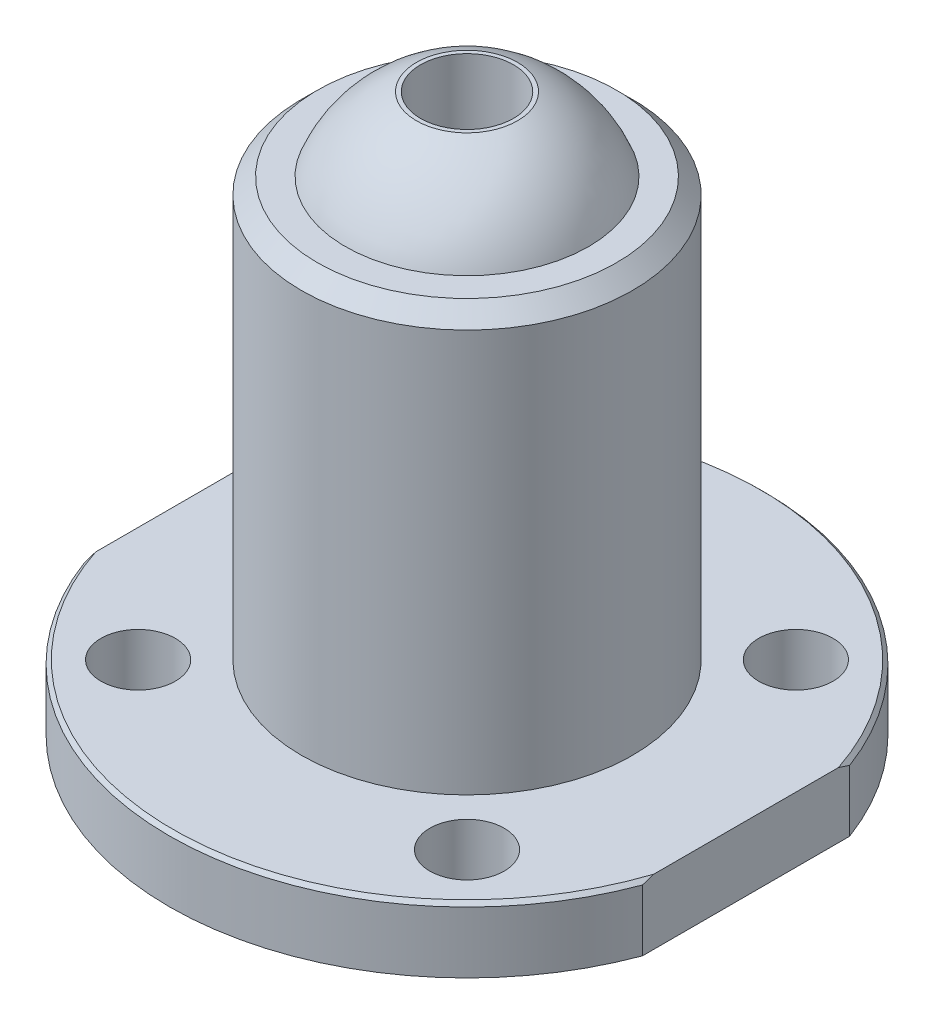
ISO-10303-21;
HEADER;
FILE_DESCRIPTION(('STEP AP214'),'2;1');
FILE_NAME('part.step','',(''),(''),'','','');
FILE_SCHEMA(('AUTOMOTIVE_DESIGN { 1 0 10303 214 1 1 1 1 }'));
ENDSEC;
DATA;
#1=APPLICATION_CONTEXT('core data for automotive mechanical design processes');
#2=APPLICATION_PROTOCOL_DEFINITION('international standard','automotive_design',2000,#1);
#3=PRODUCT_CONTEXT('',#1,'mechanical');
#4=PRODUCT('Part','Part','',(#3));
#5=PRODUCT_RELATED_PRODUCT_CATEGORY('part','',(#4));
#6=PRODUCT_DEFINITION_FORMATION('','',#4);
#7=PRODUCT_DEFINITION_CONTEXT('part definition',#1,'design');
#8=PRODUCT_DEFINITION('design','',#6,#7);
#9=PRODUCT_DEFINITION_SHAPE('','',#8);
#10=(LENGTH_UNIT() NAMED_UNIT(*) SI_UNIT(.MILLI.,.METRE.));
#11=(NAMED_UNIT(*) PLANE_ANGLE_UNIT() SI_UNIT($,.RADIAN.));
#12=(NAMED_UNIT(*) SI_UNIT($,.STERADIAN.) SOLID_ANGLE_UNIT());
#13=UNCERTAINTY_MEASURE_WITH_UNIT(LENGTH_MEASURE(1.E-05),#10,'distance_accuracy_value','');
#14=(GEOMETRIC_REPRESENTATION_CONTEXT(3) GLOBAL_UNCERTAINTY_ASSIGNED_CONTEXT((#13)) GLOBAL_UNIT_ASSIGNED_CONTEXT((#10,
#11,#12)) REPRESENTATION_CONTEXT('',''));
#15=CARTESIAN_POINT('',(0.,0.,0.));
#16=DIRECTION('',(0.,0.,1.));
#17=DIRECTION('',(1.,0.,0.));
#18=AXIS2_PLACEMENT_3D('',#15,#16,#17);
#19=CARTESIAN_POINT('',(0.,33.5828427942722,0.));
#20=DIRECTION('',(0.,1.,0.));
#21=DIRECTION('',(0.,0.,1.));
#22=AXIS2_PLACEMENT_3D('',#19,#20,#21);
#23=CYLINDRICAL_SURFACE('',#22,16.);
#24=DIRECTION('',(0.,1.,0.));
#25=VECTOR('',#24,1.);
#26=CARTESIAN_POINT('',(15.,-1.5,5.56776436283002));
#27=LINE('',#26,#25);
#28=CARTESIAN_POINT('',(15.,0.,5.56776436283002));
#29=VERTEX_POINT('',#28);
#30=CARTESIAN_POINT('',(15.,3.30000000000001,5.56776436283002));
#31=VERTEX_POINT('',#30);
#32=EDGE_CURVE('E297',#29,#31,#27,.T.);
#33=ORIENTED_EDGE('',*,*,#32,.T.);
#34=CARTESIAN_POINT('',(0.,3.30000000000001,0.));
#35=DIRECTION('',(0.,-1.,0.));
#36=DIRECTION('',(0.,0.,-1.));
#37=AXIS2_PLACEMENT_3D('',#34,#35,#36);
#38=CIRCLE('',#37,16.);
#39=CARTESIAN_POINT('',(-15.,3.30000000000001,5.56776436283002));
#40=VERTEX_POINT('',#39);
#41=EDGE_CURVE('E70',#31,#40,#38,.T.);
#42=ORIENTED_EDGE('',*,*,#41,.T.);
#43=DIRECTION('',(0.,1.,0.));
#44=VECTOR('',#43,1.);
#45=CARTESIAN_POINT('',(-15.,-1.5,5.56776436283002));
#46=LINE('',#45,#44);
#47=CARTESIAN_POINT('',(-15.,0.,5.56776436283002));
#48=VERTEX_POINT('',#47);
#49=EDGE_CURVE('E101',#48,#40,#46,.T.);
#50=ORIENTED_EDGE('',*,*,#49,.F.);
#51=CARTESIAN_POINT('',(0.,0.,0.));
#52=DIRECTION('',(0.,1.,0.));
#53=DIRECTION('',(0.,0.,1.));
#54=AXIS2_PLACEMENT_3D('',#51,#52,#53);
#55=CIRCLE('',#54,16.);
#56=EDGE_CURVE('E113',#48,#29,#55,.T.);
#57=ORIENTED_EDGE('',*,*,#56,.T.);
#58=EDGE_LOOP('',(#33,#42,#50,#57));
#59=FACE_BOUND('',#58,.T.);
#60=ADVANCED_FACE('F44',(#59),#23,.T.);
#61=CARTESIAN_POINT('',(0.,0.,0.));
#62=DIRECTION('',(0.,1.,0.));
#63=DIRECTION('',(0.,0.,1.));
#64=AXIS2_PLACEMENT_3D('',#61,#62,#63);
#65=PLANE('',#64);
#66=CARTESIAN_POINT('',(8.83883476483228,0.,8.83883476483189));
#67=DIRECTION('',(0.,1.,0.));
#68=DIRECTION('',(0.,0.,1.));
#69=AXIS2_PLACEMENT_3D('',#66,#67,#68);
#70=CIRCLE('',#69,1.99999999999987);
#71=CARTESIAN_POINT('',(8.83883476483228,0.,10.8388347648318));
#72=VERTEX_POINT('',#71);
#73=EDGE_CURVE('E110',#72,#72,#70,.T.);
#74=ORIENTED_EDGE('',*,*,#73,.T.);
#75=EDGE_LOOP('',(#74));
#76=FACE_BOUND('',#75,.T.);
#77=CARTESIAN_POINT('',(-8.83883476483141,0.,8.83883476483228));
#78=DIRECTION('',(0.,1.,0.));
#79=DIRECTION('',(0.,0.,1.));
#80=AXIS2_PLACEMENT_3D('',#77,#78,#79);
#81=CIRCLE('',#80,2.00000000000036);
#82=CARTESIAN_POINT('',(-8.83883476483141,0.,10.8388347648326));
#83=VERTEX_POINT('',#82);
#84=EDGE_CURVE('E317',#83,#83,#81,.T.);
#85=ORIENTED_EDGE('',*,*,#84,.T.);
#86=EDGE_LOOP('',(#85));
#87=FACE_BOUND('',#86,.T.);
#88=CARTESIAN_POINT('',(-8.8388347648318,0.,-8.83883476483141));
#89=DIRECTION('',(0.,1.,0.));
#90=DIRECTION('',(0.,0.,1.));
#91=AXIS2_PLACEMENT_3D('',#88,#89,#90);
#92=CIRCLE('',#91,2.00000000000052);
#93=CARTESIAN_POINT('',(-8.8388347648318,0.,-6.83883476483088));
#94=VERTEX_POINT('',#93);
#95=EDGE_CURVE('E313',#94,#94,#92,.T.);
#96=ORIENTED_EDGE('',*,*,#95,.T.);
#97=EDGE_LOOP('',(#96));
#98=FACE_BOUND('',#97,.T.);
#99=CARTESIAN_POINT('',(8.83883476483189,0.,-8.8388347648318));
#100=DIRECTION('',(0.,1.,0.));
#101=DIRECTION('',(0.,0.,1.));
#102=AXIS2_PLACEMENT_3D('',#99,#100,#101);
#103=CIRCLE('',#102,2.);
#104=CARTESIAN_POINT('',(8.83883476483189,0.,-6.8388347648318));
#105=VERTEX_POINT('',#104);
#106=EDGE_CURVE('E309',#105,#105,#103,.T.);
#107=ORIENTED_EDGE('',*,*,#106,.T.);
#108=EDGE_LOOP('',(#107));
#109=FACE_BOUND('',#108,.T.);
#110=CARTESIAN_POINT('',(15.,0.,-5.56776436283002));
#111=VERTEX_POINT('',#110);
#112=CARTESIAN_POINT('',(-15.,0.,-5.56776436283002));
#113=VERTEX_POINT('',#112);
#114=EDGE_CURVE('E120',#111,#113,#55,.T.);
#115=ORIENTED_EDGE('',*,*,#114,.F.);
#116=DIRECTION('',(0.,0.,1.));
#117=VECTOR('',#116,1.);
#118=CARTESIAN_POINT('',(15.,0.,0.));
#119=LINE('',#118,#117);
#120=EDGE_CURVE('E109',#111,#29,#119,.T.);
#121=ORIENTED_EDGE('',*,*,#120,.T.);
#122=ORIENTED_EDGE('',*,*,#56,.F.);
#123=DIRECTION('',(0.,0.,-1.));
#124=VECTOR('',#123,1.);
#125=CARTESIAN_POINT('',(-15.,0.,0.));
#126=LINE('',#125,#124);
#127=EDGE_CURVE('E99',#48,#113,#126,.T.);
#128=ORIENTED_EDGE('',*,*,#127,.T.);
#129=EDGE_LOOP('',(#115,#121,#122,#128));
#130=FACE_BOUND('',#129,.T.);
#131=ADVANCED_FACE('F118',(#76,#87,#98,#109,#130),#65,.F.);
#132=DIRECTION('',(0.,1.,0.));
#133=VECTOR('',#132,1.);
#134=CARTESIAN_POINT('',(-15.,-1.5,-5.56776436283002));
#135=LINE('',#134,#133);
#136=CARTESIAN_POINT('',(-15.,3.30000000000001,-5.56776436283002));
#137=VERTEX_POINT('',#136);
#138=EDGE_CURVE('E103',#113,#137,#135,.T.);
#139=ORIENTED_EDGE('',*,*,#138,.T.);
#140=CARTESIAN_POINT('',(0.,3.30000000000001,0.));
#141=DIRECTION('',(0.,-1.,0.));
#142=DIRECTION('',(0.,0.,-1.));
#143=AXIS2_PLACEMENT_3D('',#140,#141,#142);
#144=CIRCLE('',#143,16.);
#145=CARTESIAN_POINT('',(15.,3.30000000000001,-5.56776436283002));
#146=VERTEX_POINT('',#145);
#147=EDGE_CURVE('E11',#137,#146,#144,.T.);
#148=ORIENTED_EDGE('',*,*,#147,.T.);
#149=DIRECTION('',(0.,1.,0.));
#150=VECTOR('',#149,1.);
#151=CARTESIAN_POINT('',(15.,-1.5,-5.56776436283002));
#152=LINE('',#151,#150);
#153=EDGE_CURVE('E290',#111,#146,#152,.T.);
#154=ORIENTED_EDGE('',*,*,#153,.F.);
#155=ORIENTED_EDGE('',*,*,#114,.T.);
#156=EDGE_LOOP('',(#139,#148,#154,#155));
#157=FACE_BOUND('',#156,.T.);
#158=ADVANCED_FACE('F198',(#157),#23,.T.);
#159=CARTESIAN_POINT('',(16.,3.5,0.));
#160=DIRECTION('',(0.,-1.,0.));
#161=DIRECTION('',(0.,0.,-1.));
#162=AXIS2_PLACEMENT_3D('',#159,#160,#161);
#163=PLANE('',#162);
#164=CARTESIAN_POINT('',(8.83883476483228,3.5,8.83883476483189));
#165=DIRECTION('',(0.,1.,0.));
#166=DIRECTION('',(0.,0.,1.));
#167=AXIS2_PLACEMENT_3D('',#164,#165,#166);
#168=CIRCLE('',#167,1.99999999999987);
#169=CARTESIAN_POINT('',(8.83883476483228,3.5,10.8388347648318));
#170=VERTEX_POINT('',#169);
#171=EDGE_CURVE('E301',#170,#170,#168,.T.);
#172=ORIENTED_EDGE('',*,*,#171,.F.);
#173=EDGE_LOOP('',(#172));
#174=FACE_BOUND('',#173,.T.);
#175=CARTESIAN_POINT('',(-8.83883476483141,3.5,8.83883476483228));
#176=DIRECTION('',(0.,1.,0.));
#177=DIRECTION('',(0.,0.,1.));
#178=AXIS2_PLACEMENT_3D('',#175,#176,#177);
#179=CIRCLE('',#178,2.00000000000036);
#180=CARTESIAN_POINT('',(-8.83883476483141,3.5,10.8388347648326));
#181=VERTEX_POINT('',#180);
#182=EDGE_CURVE('E359',#181,#181,#179,.T.);
#183=ORIENTED_EDGE('',*,*,#182,.F.);
#184=EDGE_LOOP('',(#183));
#185=FACE_BOUND('',#184,.T.);
#186=CARTESIAN_POINT('',(-8.8388347648318,3.5,-8.83883476483141));
#187=DIRECTION('',(0.,1.,0.));
#188=DIRECTION('',(0.,0.,1.));
#189=AXIS2_PLACEMENT_3D('',#186,#187,#188);
#190=CIRCLE('',#189,2.00000000000052);
#191=CARTESIAN_POINT('',(-8.8388347648318,3.5,-6.83883476483088));
#192=VERTEX_POINT('',#191);
#193=EDGE_CURVE('E303',#192,#192,#190,.T.);
#194=ORIENTED_EDGE('',*,*,#193,.F.);
#195=EDGE_LOOP('',(#194));
#196=FACE_BOUND('',#195,.T.);
#197=CARTESIAN_POINT('',(8.83883476483189,3.5,-8.8388347648318));
#198=DIRECTION('',(0.,1.,0.));
#199=DIRECTION('',(0.,0.,1.));
#200=AXIS2_PLACEMENT_3D('',#197,#198,#199);
#201=CIRCLE('',#200,2.);
#202=CARTESIAN_POINT('',(8.83883476483189,3.5,-6.8388347648318));
#203=VERTEX_POINT('',#202);
#204=EDGE_CURVE('E305',#203,#203,#201,.T.);
#205=ORIENTED_EDGE('',*,*,#204,.F.);
#206=EDGE_LOOP('',(#205));
#207=FACE_BOUND('',#206,.T.);
#208=CARTESIAN_POINT('',(0.,3.5,0.));
#209=DIRECTION('',(0.,1.,0.));
#210=DIRECTION('',(0.,0.,1.));
#211=AXIS2_PLACEMENT_3D('',#208,#209,#210);
#212=CIRCLE('',#211,8.9);
#213=CARTESIAN_POINT('',(0.,3.5,8.9));
#214=VERTEX_POINT('',#213);
#215=EDGE_CURVE('E121',#214,#214,#212,.T.);
#216=ORIENTED_EDGE('',*,*,#215,.F.);
#217=EDGE_LOOP('',(#216));
#218=FACE_BOUND('',#217,.T.);
#219=DIRECTION('',(0.,0.,-1.));
#220=VECTOR('',#219,1.);
#221=CARTESIAN_POINT('',(-15.,3.5,-5.56776436283002));
#222=LINE('',#221,#220);
#223=CARTESIAN_POINT('',(-15.,3.5,4.96386945839638));
#224=VERTEX_POINT('',#223);
#225=CARTESIAN_POINT('',(-15.,3.5,-4.96386945839638));
#226=VERTEX_POINT('',#225);
#227=EDGE_CURVE('E115',#224,#226,#222,.T.);
#228=ORIENTED_EDGE('',*,*,#227,.F.);
#229=CARTESIAN_POINT('',(0.,3.5,0.));
#230=DIRECTION('',(0.,-1.,0.));
#231=DIRECTION('',(0.,0.,-1.));
#232=AXIS2_PLACEMENT_3D('',#229,#230,#231);
#233=CIRCLE('',#232,15.8);
#234=CARTESIAN_POINT('',(15.,3.5,4.96386945839638));
#235=VERTEX_POINT('',#234);
#236=EDGE_CURVE('E134',#224,#235,#233,.F.);
#237=ORIENTED_EDGE('',*,*,#236,.T.);
#238=DIRECTION('',(0.,0.,1.));
#239=VECTOR('',#238,1.);
#240=CARTESIAN_POINT('',(15.,3.5,-5.56776436283002));
#241=LINE('',#240,#239);
#242=CARTESIAN_POINT('',(15.,3.5,-4.96386945839638));
#243=VERTEX_POINT('',#242);
#244=EDGE_CURVE('E288',#243,#235,#241,.T.);
#245=ORIENTED_EDGE('',*,*,#244,.F.);
#246=CARTESIAN_POINT('',(0.,3.5,0.));
#247=DIRECTION('',(0.,-1.,0.));
#248=DIRECTION('',(0.,0.,-1.));
#249=AXIS2_PLACEMENT_3D('',#246,#247,#248);
#250=CIRCLE('',#249,15.8);
#251=EDGE_CURVE('E125',#243,#226,#250,.F.);
#252=ORIENTED_EDGE('',*,*,#251,.T.);
#253=EDGE_LOOP('',(#228,#237,#245,#252));
#254=FACE_BOUND('',#253,.T.);
#255=ADVANCED_FACE('F194',(#174,#185,#196,#207,#218,#254),#163,.F.);
#256=CARTESIAN_POINT('',(0.,33.5828427942722,0.));
#257=DIRECTION('',(0.,1.,0.));
#258=DIRECTION('',(0.,0.,1.));
#259=AXIS2_PLACEMENT_3D('',#256,#257,#258);
#260=CYLINDRICAL_SURFACE('',#259,8.9);
#261=CARTESIAN_POINT('',(0.,25.138348415311,0.));
#262=DIRECTION('',(0.,1.,0.));
#263=DIRECTION('',(0.,0.,1.));
#264=AXIS2_PLACEMENT_3D('',#261,#262,#263);
#265=CIRCLE('',#264,8.9);
#266=CARTESIAN_POINT('',(0.,25.138348415311,8.9));
#267=VERTEX_POINT('',#266);
#268=EDGE_CURVE('E127',#267,#267,#265,.T.);
#269=ORIENTED_EDGE('',*,*,#268,.F.);
#270=EDGE_LOOP('',(#269));
#271=FACE_BOUND('',#270,.T.);
#272=ORIENTED_EDGE('',*,*,#215,.T.);
#273=EDGE_LOOP('',(#272));
#274=FACE_BOUND('',#273,.T.);
#275=ADVANCED_FACE('F190',(#271,#274),#260,.T.);
#276=CARTESIAN_POINT('',(0.,25.138348415311,0.));
#277=DIRECTION('',(0.,-1.,0.));
#278=DIRECTION('',(0.,0.,-1.));
#279=AXIS2_PLACEMENT_3D('',#276,#277,#278);
#280=CONICAL_SURFACE('',#279,8.9,0.785398163397451);
#281=CARTESIAN_POINT('',(0.,26.,0.));
#282=DIRECTION('',(0.,1.,0.));
#283=DIRECTION('',(0.,0.,1.));
#284=AXIS2_PLACEMENT_3D('',#281,#282,#283);
#285=CIRCLE('',#284,8.03834841531101);
#286=CARTESIAN_POINT('',(0.,26.,8.03834841531101));
#287=VERTEX_POINT('',#286);
#288=EDGE_CURVE('E342',#287,#287,#285,.T.);
#289=ORIENTED_EDGE('',*,*,#288,.F.);
#290=EDGE_LOOP('',(#289));
#291=FACE_BOUND('',#290,.T.);
#292=ORIENTED_EDGE('',*,*,#268,.T.);
#293=EDGE_LOOP('',(#292));
#294=FACE_BOUND('',#293,.T.);
#295=ADVANCED_FACE('F186',(#291,#294),#280,.T.);
#296=CARTESIAN_POINT('',(8.03834841531101,26.,0.));
#297=DIRECTION('',(0.,-1.,0.));
#298=DIRECTION('',(0.,0.,-1.));
#299=AXIS2_PLACEMENT_3D('',#296,#297,#298);
#300=PLANE('',#299);
#301=CARTESIAN_POINT('',(0.,26.,0.));
#302=DIRECTION('',(0.,1.,0.));
#303=DIRECTION('',(0.,0.,1.));
#304=AXIS2_PLACEMENT_3D('',#301,#302,#303);
#305=CIRCLE('',#304,6.53834841531101);
#306=CARTESIAN_POINT('',(6.53834841531101,26.,0.));
#307=VERTEX_POINT('',#306);
#308=EDGE_CURVE('E338',#307,#307,#305,.T.);
#309=ORIENTED_EDGE('',*,*,#308,.F.);
#310=EDGE_LOOP('',(#309));
#311=FACE_BOUND('',#310,.T.);
#312=ORIENTED_EDGE('',*,*,#288,.T.);
#313=EDGE_LOOP('',(#312));
#314=FACE_BOUND('',#313,.T.);
#315=ADVANCED_FACE('F182',(#311,#314),#300,.F.);
#316=CARTESIAN_POINT('',(0.,23.5,0.));
#317=DIRECTION('',(0.,1.,0.));
#318=DIRECTION('',(1.,0.,0.));
#319=AXIS2_PLACEMENT_3D('',#316,#317,#318);
#320=SPHERICAL_SURFACE('',#319,7.);
#321=CARTESIAN_POINT('',(0.,29.95,0.));
#322=DIRECTION('',(0.,1.,0.));
#323=DIRECTION('',(0.,0.,1.));
#324=AXIS2_PLACEMENT_3D('',#321,#322,#323);
#325=CIRCLE('',#324,2.71983455379184);
#326=CARTESIAN_POINT('',(2.71983455379184,29.95,0.));
#327=VERTEX_POINT('',#326);
#328=EDGE_CURVE('E331',#327,#327,#325,.T.);
#329=CARTESIAN_POINT('',(2.71983455379184,29.95,0.));
#330=CARTESIAN_POINT('',(2.77402363147823,29.9271497453028,0.));
#331=CARTESIAN_POINT('',(2.82792461035151,29.9036162925481,0.));
#332=CARTESIAN_POINT('',(2.93511643728715,29.8551986164954,0.));
#333=CARTESIAN_POINT('',(2.98840728534952,29.8303143931974,0.));
#334=CARTESIAN_POINT('',(3.09434491747862,29.7792108016301,0.));
#335=CARTESIAN_POINT('',(3.14699170154536,29.7529914333606,0.));
#336=CARTESIAN_POINT('',(3.25160778546723,29.699234255439,0.));
#337=CARTESIAN_POINT('',(3.30357708532235,29.6716964457868,0.));
#338=CARTESIAN_POINT('',(3.40680518312887,29.6153198645814,0.));
#339=CARTESIAN_POINT('',(3.45806398108026,29.5864810930282,0.));
#340=CARTESIAN_POINT('',(3.55983851616645,29.5275209104031,0.));
#341=CARTESIAN_POINT('',(3.61035425330125,29.4973994993312,0.));
#342=CARTESIAN_POINT('',(3.71061057784882,29.4358931703833,0.));
#343=CARTESIAN_POINT('',(3.76035116526161,29.4045082525073,0.));
#344=CARTESIAN_POINT('',(3.85902559438377,29.3404948464525,0.));
#345=CARTESIAN_POINT('',(3.90795943609316,29.3078663582737,0.));
#346=CARTESIAN_POINT('',(4.00498929014275,29.2413865377348,0.));
#347=CARTESIAN_POINT('',(4.05308530248295,29.2075352053748,0.));
#348=CARTESIAN_POINT('',(4.14840894637075,29.138631199452,0.));
#349=CARTESIAN_POINT('',(4.19563657791835,29.1035785258893,0.));
#350=CARTESIAN_POINT('',(4.28919346039794,29.0322941036303,0.));
#351=CARTESIAN_POINT('',(4.33552271132994,28.996062354934,0.));
#352=CARTESIAN_POINT('',(4.42725340342524,28.9224427974519,0.));
#353=CARTESIAN_POINT('',(4.47265484458853,28.8850549886661,0.));
#354=CARTESIAN_POINT('',(4.56250107735366,28.8091470603974,0.));
#355=CARTESIAN_POINT('',(4.60694586895549,28.7706269409144,0.));
#356=CARTESIAN_POINT('',(4.69485057048569,28.6924788599078,0.));
#357=CARTESIAN_POINT('',(4.73831048041406,28.652850898384,0.));
#358=CARTESIAN_POINT('',(4.82421781209945,28.5725123056727,0.));
#359=CARTESIAN_POINT('',(4.86666523385647,28.5318016744852,0.));
#360=CARTESIAN_POINT('',(4.95052062585153,28.4493236025539,0.));
#361=CARTESIAN_POINT('',(4.99192859608957,28.4075561618103,0.));
#362=CARTESIAN_POINT('',(5.0736787819769,28.3229910021787,0.));
#363=CARTESIAN_POINT('',(5.11402099762619,28.2801932832907,0.));
#364=CARTESIAN_POINT('',(5.19361404825228,28.1935947532329,0.));
#365=CARTESIAN_POINT('',(5.23286488322909,28.1497939420631,0.));
#366=CARTESIAN_POINT('',(5.31025023969063,28.061217050486,0.));
#367=CARTESIAN_POINT('',(5.34838476117537,28.0164409700788,0.));
#368=CARTESIAN_POINT('',(5.42351326693515,27.9259419825792,0.));
#369=CARTESIAN_POINT('',(5.4605072512102,27.880219075487,0.));
#370=CARTESIAN_POINT('',(5.53333118332214,27.7878554786109,0.));
#371=CARTESIAN_POINT('',(5.56916113115902,27.7412147888271,0.));
#372=CARTESIAN_POINT('',(5.63963423058299,27.647045253553,0.));
#373=CARTESIAN_POINT('',(5.67427738217007,27.5995164080629,0.));
#374=CARTESIAN_POINT('',(5.74235488315494,27.5036007525328,0.));
#375=CARTESIAN_POINT('',(5.77578923255272,27.4552139424929,0.));
#376=CARTESIAN_POINT('',(5.84142789107807,27.3576130940169,0.));
#377=CARTESIAN_POINT('',(5.87363220020564,27.3083990555807,0.));
#378=CARTESIAN_POINT('',(5.9367903214297,27.2091750119259,0.));
#379=CARTESIAN_POINT('',(5.96774413352618,27.1591650067073,0.));
#380=CARTESIAN_POINT('',(6.0283815983512,27.058380796749,0.));
#381=CARTESIAN_POINT('',(6.05806525107974,27.0076065920093,0.));
#382=CARTESIAN_POINT('',(6.11614354133732,26.9053262355708,0.));
#383=CARTESIAN_POINT('',(6.14453817886636,26.8538200838719,0.));
#384=CARTESIAN_POINT('',(6.20002040290104,26.7501085515172,0.));
#385=CARTESIAN_POINT('',(6.22710798940668,26.6979031708614,0.));
#386=CARTESIAN_POINT('',(6.27995890134437,26.5928263409106,0.));
#387=CARTESIAN_POINT('',(6.30572222677643,26.5399548916156,0.));
#388=CARTESIAN_POINT('',(6.35590826446028,26.4335795146957,0.));
#389=CARTESIAN_POINT('',(6.38033097671207,26.3800755870709,0.));
#390=CARTESIAN_POINT('',(6.42782022499933,26.2724692198368,0.));
#391=CARTESIAN_POINT('',(6.4508867610348,26.2183667802275,0.));
#392=CARTESIAN_POINT('',(6.49564918861228,26.1095978315633,0.));
#393=CARTESIAN_POINT('',(6.5173450801543,26.0549313225084,0.));
#394=CARTESIAN_POINT('',(6.53834841531101,26.,0.));
#395=B_SPLINE_CURVE_WITH_KNOTS('',3,(#329,#330,#331,#332,#333,#334,#335,#336,#337,#338,#339,
#340,#341,#342,#343,#344,#345,#346,#347,#348,#349,#350,#351,#352,#353,#354,#355,#356,#357,#358,
#359,#360,#361,#362,#363,#364,#365,#366,#367,#368,#369,#370,#371,#372,#373,#374,#375,#376,#377,
#378,#379,#380,#381,#382,#383,#384,#385,#386,#387,#388,#389,#390,#391,#392,#393,#394),
.UNSPECIFIED.,.F.,.F.,(4,2,2,2,2,2,2,2,2,2,2,2,2,2,2,2,2,2,2,2,2,2,2,2,2,2,2,2,2,2,2,2,4),(0.,
0.176424659219805,0.352849318439612,0.529273977659418,0.705698636879223,0.88212329609903,
1.05854795531884,1.23497261453864,1.41139727375845,1.58782193297825,1.76424659219806,
1.94067125141786,2.11709591063767,2.29352056985748,2.46994522907728,2.64636988829709,
2.8227945475169,2.9992192067367,3.17564386595651,3.35206852517631,3.52849318439612,
3.70491784361593,3.88134250283573,4.05776716205554,4.23419182127534,4.41061648049515,
4.58704113971496,4.76346579893476,4.93989045815457,5.11631511737438,5.29273977659418,
5.46916443581399,5.64558909503379),.UNSPECIFIED.);
#396=EDGE_CURVE('BSEAM178',#327,#307,#395,.T.);
#397=ORIENTED_EDGE('',*,*,#328,.F.);
#398=ORIENTED_EDGE('',*,*,#308,.T.);
#399=ORIENTED_EDGE('',*,*,#396,.T.);
#400=ORIENTED_EDGE('',*,*,#396,.F.);
#401=EDGE_LOOP('',(#397,#399,#398,#400));
#402=FACE_BOUND('',#401,.T.);
#403=ADVANCED_FACE('F178',(#402),#320,.T.);
#404=CARTESIAN_POINT('',(0.,29.95,0.));
#405=DIRECTION('',(0.,-1.,0.));
#406=DIRECTION('',(0.,0.,-1.));
#407=AXIS2_PLACEMENT_3D('',#404,#405,#406);
#408=PLANE('',#407);
#409=CARTESIAN_POINT('',(0.,29.95,0.));
#410=DIRECTION('',(0.,1.,0.));
#411=DIRECTION('',(0.,0.,1.));
#412=AXIS2_PLACEMENT_3D('',#409,#410,#411);
#413=CIRCLE('',#412,2.5);
#414=CARTESIAN_POINT('',(0.,29.95,2.5));
#415=VERTEX_POINT('',#414);
#416=EDGE_CURVE('E326',#415,#415,#413,.T.);
#417=ORIENTED_EDGE('',*,*,#416,.F.);
#418=EDGE_LOOP('',(#417));
#419=FACE_BOUND('',#418,.T.);
#420=ORIENTED_EDGE('',*,*,#328,.T.);
#421=EDGE_LOOP('',(#420));
#422=FACE_BOUND('',#421,.T.);
#423=ADVANCED_FACE('F174',(#419,#422),#408,.F.);
#424=CARTESIAN_POINT('',(0.,24.95,0.));
#425=DIRECTION('',(0.,1.,0.));
#426=DIRECTION('',(0.,0.,1.));
#427=AXIS2_PLACEMENT_3D('',#424,#425,#426);
#428=CYLINDRICAL_SURFACE('',#427,2.5);
#429=CARTESIAN_POINT('',(0.,24.95,0.));
#430=DIRECTION('',(0.,1.,0.));
#431=DIRECTION('',(0.,0.,1.));
#432=AXIS2_PLACEMENT_3D('',#429,#430,#431);
#433=CIRCLE('',#432,2.5);
#434=CARTESIAN_POINT('',(0.,24.95,2.5));
#435=VERTEX_POINT('',#434);
#436=EDGE_CURVE('E327',#435,#435,#433,.T.);
#437=ORIENTED_EDGE('',*,*,#436,.F.);
#438=EDGE_LOOP('',(#437));
#439=FACE_BOUND('',#438,.T.);
#440=ORIENTED_EDGE('',*,*,#416,.T.);
#441=EDGE_LOOP('',(#440));
#442=FACE_BOUND('',#441,.T.);
#443=ADVANCED_FACE('F170',(#439,#442),#428,.F.);
#444=CARTESIAN_POINT('',(0.,24.95,0.));
#445=DIRECTION('',(0.,1.,0.));
#446=DIRECTION('',(0.,0.,1.));
#447=AXIS2_PLACEMENT_3D('',#444,#445,#446);
#448=PLANE('',#447);
#449=ORIENTED_EDGE('',*,*,#436,.T.);
#450=EDGE_LOOP('',(#449));
#451=FACE_BOUND('',#450,.T.);
#452=ADVANCED_FACE('F166',(#451),#448,.T.);
#453=CARTESIAN_POINT('',(8.83883476483189,-1.5,-8.8388347648318));
#454=DIRECTION('',(0.,1.,0.));
#455=DIRECTION('',(0.,0.,1.));
#456=AXIS2_PLACEMENT_3D('',#453,#454,#455);
#457=CYLINDRICAL_SURFACE('',#456,2.);
#458=ORIENTED_EDGE('',*,*,#204,.T.);
#459=EDGE_LOOP('',(#458));
#460=FACE_BOUND('',#459,.T.);
#461=ORIENTED_EDGE('',*,*,#106,.F.);
#462=EDGE_LOOP('',(#461));
#463=FACE_BOUND('',#462,.T.);
#464=ADVANCED_FACE('F161',(#460,#463),#457,.F.);
#465=CARTESIAN_POINT('',(-8.8388347648318,-1.5,-8.83883476483141));
#466=DIRECTION('',(0.,1.,0.));
#467=DIRECTION('',(0.,0.,1.));
#468=AXIS2_PLACEMENT_3D('',#465,#466,#467);
#469=CYLINDRICAL_SURFACE('',#468,2.00000000000052);
#470=ORIENTED_EDGE('',*,*,#193,.T.);
#471=EDGE_LOOP('',(#470));
#472=FACE_BOUND('',#471,.T.);
#473=ORIENTED_EDGE('',*,*,#95,.F.);
#474=EDGE_LOOP('',(#473));
#475=FACE_BOUND('',#474,.T.);
#476=ADVANCED_FACE('F165',(#472,#475),#469,.F.);
#477=CARTESIAN_POINT('',(-8.83883476483141,-1.5,8.83883476483228));
#478=DIRECTION('',(0.,1.,0.));
#479=DIRECTION('',(0.,0.,1.));
#480=AXIS2_PLACEMENT_3D('',#477,#478,#479);
#481=CYLINDRICAL_SURFACE('',#480,2.00000000000036);
#482=ORIENTED_EDGE('',*,*,#182,.T.);
#483=EDGE_LOOP('',(#482));
#484=FACE_BOUND('',#483,.T.);
#485=ORIENTED_EDGE('',*,*,#84,.F.);
#486=EDGE_LOOP('',(#485));
#487=FACE_BOUND('',#486,.T.);
#488=ADVANCED_FACE('F228',(#484,#487),#481,.F.);
#489=CARTESIAN_POINT('',(8.83883476483228,-1.5,8.83883476483189));
#490=DIRECTION('',(0.,1.,0.));
#491=DIRECTION('',(0.,0.,1.));
#492=AXIS2_PLACEMENT_3D('',#489,#490,#491);
#493=CYLINDRICAL_SURFACE('',#492,1.99999999999987);
#494=ORIENTED_EDGE('',*,*,#171,.T.);
#495=EDGE_LOOP('',(#494));
#496=FACE_BOUND('',#495,.T.);
#497=ORIENTED_EDGE('',*,*,#73,.F.);
#498=EDGE_LOOP('',(#497));
#499=FACE_BOUND('',#498,.T.);
#500=ADVANCED_FACE('F159',(#496,#499),#493,.F.);
#501=CARTESIAN_POINT('',(-15.,-1.5,-5.56776436283002));
#502=DIRECTION('',(1.,0.,0.));
#503=DIRECTION('',(0.,0.,-1.));
#504=AXIS2_PLACEMENT_3D('',#501,#502,#503);
#505=PLANE('',#504);
#506=ORIENTED_EDGE('',*,*,#49,.T.);
#507=CARTESIAN_POINT('',(-15.,3.30000000000001,5.56776436283002));
#508=CARTESIAN_POINT('',(-15.,3.33486693351186,5.46762315587555));
#509=CARTESIAN_POINT('',(-15.,3.36896706112957,5.36722799549452));
#510=CARTESIAN_POINT('',(-15.,3.43563372891605,5.16592969438751));
#511=CARTESIAN_POINT('',(-15.,3.46820026796499,5.06502655329065));
#512=CARTESIAN_POINT('',(-15.,3.5,4.96386945839638));
#513=B_SPLINE_CURVE_WITH_KNOTS('',3,(#507,#508,#509,#510,#511,#512),.UNSPECIFIED.,.F.,.F.,(4,2,
4),(0.,0.318084992389273,0.636170217037559),.UNSPECIFIED.);
#514=EDGE_CURVE('E55',#40,#224,#513,.T.);
#515=ORIENTED_EDGE('',*,*,#514,.T.);
#516=ORIENTED_EDGE('',*,*,#227,.T.);
#517=CARTESIAN_POINT('',(-15.,3.5,-4.96386945839638));
#518=CARTESIAN_POINT('',(-15.,3.46820026796499,-5.06502655329065));
#519=CARTESIAN_POINT('',(-15.,3.43563372891605,-5.16592969438751));
#520=CARTESIAN_POINT('',(-15.,3.36896706112957,-5.36722799549452));
#521=CARTESIAN_POINT('',(-15.,3.33486693351185,-5.46762315587555));
#522=CARTESIAN_POINT('',(-15.,3.30000000000001,-5.56776436283002));
#523=B_SPLINE_CURVE_WITH_KNOTS('',3,(#517,#518,#519,#520,#521,#522),.UNSPECIFIED.,.F.,.F.,(4,2,
4),(0.,0.318085224648286,0.636170217037559),.UNSPECIFIED.);
#524=EDGE_CURVE('E62',#226,#137,#523,.T.);
#525=ORIENTED_EDGE('',*,*,#524,.T.);
#526=ORIENTED_EDGE('',*,*,#138,.F.);
#527=ORIENTED_EDGE('',*,*,#127,.F.);
#528=EDGE_LOOP('',(#506,#515,#516,#525,#526,#527));
#529=FACE_BOUND('',#528,.T.);
#530=ADVANCED_FACE('F100',(#529),#505,.F.);
#531=CARTESIAN_POINT('',(15.,-1.5,-5.56776436283002));
#532=DIRECTION('',(-1.,0.,0.));
#533=DIRECTION('',(0.,0.,1.));
#534=AXIS2_PLACEMENT_3D('',#531,#532,#533);
#535=PLANE('',#534);
#536=ORIENTED_EDGE('',*,*,#244,.T.);
#537=CARTESIAN_POINT('',(15.,3.5,4.96386945839638));
#538=CARTESIAN_POINT('',(15.,3.46820026796499,5.06502655329065));
#539=CARTESIAN_POINT('',(15.,3.43563372891605,5.16592969438751));
#540=CARTESIAN_POINT('',(15.,3.36896706112957,5.36722799549452));
#541=CARTESIAN_POINT('',(15.,3.33486693351185,5.46762315587555));
#542=CARTESIAN_POINT('',(15.,3.30000000000001,5.56776436283002));
#543=B_SPLINE_CURVE_WITH_KNOTS('',3,(#537,#538,#539,#540,#541,#542),.UNSPECIFIED.,.F.,.F.,(4,2,
4),(0.,0.318085224648286,0.636170217037559),.UNSPECIFIED.);
#544=EDGE_CURVE('E146',#235,#31,#543,.T.);
#545=ORIENTED_EDGE('',*,*,#544,.T.);
#546=ORIENTED_EDGE('',*,*,#32,.F.);
#547=ORIENTED_EDGE('',*,*,#120,.F.);
#548=ORIENTED_EDGE('',*,*,#153,.T.);
#549=CARTESIAN_POINT('',(15.,3.30000000000001,-5.56776436283002));
#550=CARTESIAN_POINT('',(15.,3.33486693351186,-5.46762315587555));
#551=CARTESIAN_POINT('',(15.,3.36896706112957,-5.36722799549452));
#552=CARTESIAN_POINT('',(15.,3.43563372891605,-5.16592969438751));
#553=CARTESIAN_POINT('',(15.,3.46820026796499,-5.06502655329065));
#554=CARTESIAN_POINT('',(15.,3.5,-4.96386945839638));
#555=B_SPLINE_CURVE_WITH_KNOTS('',3,(#549,#550,#551,#552,#553,#554),.UNSPECIFIED.,.F.,.F.,(4,2,
4),(0.,0.318084992389273,0.636170217037559),.UNSPECIFIED.);
#556=EDGE_CURVE('E138',#146,#243,#555,.T.);
#557=ORIENTED_EDGE('',*,*,#556,.T.);
#558=EDGE_LOOP('',(#536,#545,#546,#547,#548,#557));
#559=FACE_BOUND('',#558,.T.);
#560=ADVANCED_FACE('F152',(#559),#535,.F.);
#561=CARTESIAN_POINT('',(0.,3.5,0.));
#562=DIRECTION('',(0.,-1.,0.));
#563=DIRECTION('',(0.,0.,-1.));
#564=AXIS2_PLACEMENT_3D('',#561,#562,#563);
#565=CONICAL_SURFACE('',#564,15.8,0.785398163397448);
#566=ORIENTED_EDGE('',*,*,#514,.F.);
#567=ORIENTED_EDGE('',*,*,#41,.F.);
#568=ORIENTED_EDGE('',*,*,#544,.F.);
#569=ORIENTED_EDGE('',*,*,#236,.F.);
#570=EDGE_LOOP('',(#566,#567,#568,#569));
#571=FACE_BOUND('',#570,.T.);
#572=ADVANCED_FACE('F157',(#571),#565,.T.);
#573=CARTESIAN_POINT('',(0.,3.5,0.));
#574=DIRECTION('',(0.,-1.,0.));
#575=DIRECTION('',(0.,0.,-1.));
#576=AXIS2_PLACEMENT_3D('',#573,#574,#575);
#577=CONICAL_SURFACE('',#576,15.8,0.785398163397448);
#578=ORIENTED_EDGE('',*,*,#556,.F.);
#579=ORIENTED_EDGE('',*,*,#147,.F.);
#580=ORIENTED_EDGE('',*,*,#524,.F.);
#581=ORIENTED_EDGE('',*,*,#251,.F.);
#582=EDGE_LOOP('',(#578,#579,#580,#581));
#583=FACE_BOUND('',#582,.T.);
#584=ADVANCED_FACE('F47',(#583),#577,.T.);
#585=CLOSED_SHELL('',(#60,#131,#158,#255,#275,#295,#315,#403,#423,#443,#452,#464,#476,#488,#500,
#530,#560,#572,#584));
#586=MANIFOLD_SOLID_BREP('B2',#585);
#587=ADVANCED_BREP_SHAPE_REPRESENTATION('',(#18,#586),#14);
#588=SHAPE_DEFINITION_REPRESENTATION(#9,#587);
ENDSEC;
END-ISO-10303-21;
